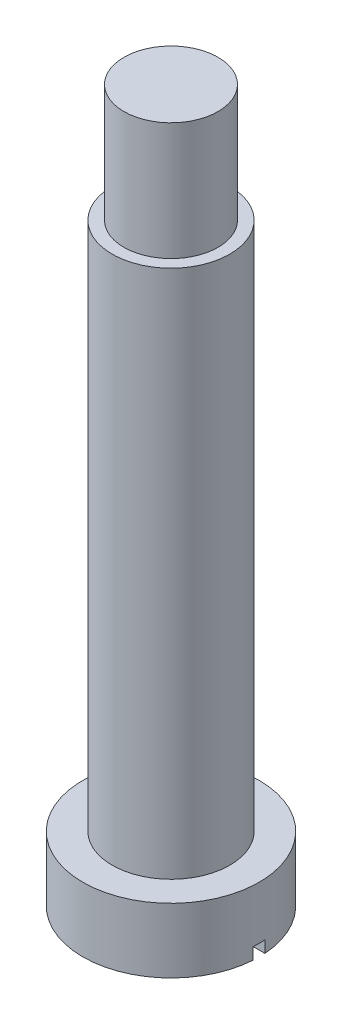
ISO-10303-21;
HEADER;
FILE_DESCRIPTION(('STEP AP214'),'2;1');
FILE_NAME('part.step','',(''),(''),'','','');
FILE_SCHEMA(('AUTOMOTIVE_DESIGN { 1 0 10303 214 1 1 1 1 }'));
ENDSEC;
DATA;
#1=APPLICATION_CONTEXT('core data for automotive mechanical design processes');
#2=APPLICATION_PROTOCOL_DEFINITION('international standard','automotive_design',2000,#1);
#3=PRODUCT_CONTEXT('',#1,'mechanical');
#4=PRODUCT('Part','Part','',(#3));
#5=PRODUCT_RELATED_PRODUCT_CATEGORY('part','',(#4));
#6=PRODUCT_DEFINITION_FORMATION('','',#4);
#7=PRODUCT_DEFINITION_CONTEXT('part definition',#1,'design');
#8=PRODUCT_DEFINITION('design','',#6,#7);
#9=PRODUCT_DEFINITION_SHAPE('','',#8);
#10=(LENGTH_UNIT() NAMED_UNIT(*) SI_UNIT(.MILLI.,.METRE.));
#11=(NAMED_UNIT(*) PLANE_ANGLE_UNIT() SI_UNIT($,.RADIAN.));
#12=(NAMED_UNIT(*) SI_UNIT($,.STERADIAN.) SOLID_ANGLE_UNIT());
#13=UNCERTAINTY_MEASURE_WITH_UNIT(LENGTH_MEASURE(1.E-05),#10,'distance_accuracy_value','');
#14=(GEOMETRIC_REPRESENTATION_CONTEXT(3) GLOBAL_UNCERTAINTY_ASSIGNED_CONTEXT((#13)) GLOBAL_UNIT_ASSIGNED_CONTEXT((#10,
#11,#12)) REPRESENTATION_CONTEXT('',''));
#15=CARTESIAN_POINT('',(0.,0.,0.));
#16=DIRECTION('',(0.,0.,1.));
#17=DIRECTION('',(1.,0.,0.));
#18=AXIS2_PLACEMENT_3D('',#15,#16,#17);
#19=CARTESIAN_POINT('',(0.,-5.5,0.));
#20=DIRECTION('',(0.,1.,0.));
#21=DIRECTION('',(0.,0.,1.));
#22=AXIS2_PLACEMENT_3D('',#19,#20,#21);
#23=CYLINDRICAL_SURFACE('',#22,7.5);
#24=CARTESIAN_POINT('',(0.,0.,0.));
#25=DIRECTION('',(0.,1.,0.));
#26=DIRECTION('',(0.,0.,1.));
#27=AXIS2_PLACEMENT_3D('',#24,#25,#26);
#28=CIRCLE('',#27,7.5);
#29=CARTESIAN_POINT('',(0.,0.,7.5));
#30=VERTEX_POINT('',#29);
#31=EDGE_CURVE('E112',#30,#30,#28,.T.);
#32=ORIENTED_EDGE('',*,*,#31,.F.);
#33=EDGE_LOOP('',(#32));
#34=FACE_BOUND('',#33,.T.);
#35=CARTESIAN_POINT('',(0.,-5.5,0.));
#36=DIRECTION('',(0.,1.,0.));
#37=DIRECTION('',(0.,0.,1.));
#38=AXIS2_PLACEMENT_3D('',#35,#36,#37);
#39=CIRCLE('',#38,7.5);
#40=CARTESIAN_POINT('',(7.48331477354788,-5.5,-0.5));
#41=VERTEX_POINT('',#40);
#42=CARTESIAN_POINT('',(-7.48331477354788,-5.5,-0.5));
#43=VERTEX_POINT('',#42);
#44=EDGE_CURVE('E115',#41,#43,#39,.T.);
#45=ORIENTED_EDGE('',*,*,#44,.T.);
#46=DIRECTION('',(0.,1.,0.));
#47=VECTOR('',#46,1.);
#48=CARTESIAN_POINT('',(-7.48331477354788,-5.5,-0.5));
#49=LINE('',#48,#47);
#50=CARTESIAN_POINT('',(-7.48331477354788,-4.5,-0.5));
#51=VERTEX_POINT('',#50);
#52=EDGE_CURVE('E84',#43,#51,#49,.T.);
#53=ORIENTED_EDGE('',*,*,#52,.T.);
#54=CARTESIAN_POINT('',(0.,-4.5,0.));
#55=DIRECTION('',(0.,1.,0.));
#56=DIRECTION('',(0.,0.,1.));
#57=AXIS2_PLACEMENT_3D('',#54,#55,#56);
#58=CIRCLE('',#57,7.5);
#59=CARTESIAN_POINT('',(-7.48331477354788,-4.5,0.5));
#60=VERTEX_POINT('',#59);
#61=EDGE_CURVE('E11',#60,#51,#58,.F.);
#62=ORIENTED_EDGE('',*,*,#61,.F.);
#63=DIRECTION('',(0.,1.,0.));
#64=VECTOR('',#63,1.);
#65=CARTESIAN_POINT('',(-7.48331477354788,-5.5,0.5));
#66=LINE('',#65,#64);
#67=CARTESIAN_POINT('',(-7.48331477354788,-5.5,0.5));
#68=VERTEX_POINT('',#67);
#69=EDGE_CURVE('E82',#68,#60,#66,.T.);
#70=ORIENTED_EDGE('',*,*,#69,.F.);
#71=CARTESIAN_POINT('',(7.48331477354788,-5.5,0.5));
#72=VERTEX_POINT('',#71);
#73=EDGE_CURVE('E116',#68,#72,#39,.T.);
#74=ORIENTED_EDGE('',*,*,#73,.T.);
#75=DIRECTION('',(0.,1.,0.));
#76=VECTOR('',#75,1.);
#77=CARTESIAN_POINT('',(7.48331477354788,-5.5,0.5));
#78=LINE('',#77,#76);
#79=CARTESIAN_POINT('',(7.48331477354788,-4.5,0.5));
#80=VERTEX_POINT('',#79);
#81=EDGE_CURVE('E52',#80,#72,#78,.F.);
#82=ORIENTED_EDGE('',*,*,#81,.F.);
#83=CARTESIAN_POINT('',(7.48331477354788,-4.5,-0.5));
#84=VERTEX_POINT('',#83);
#85=EDGE_CURVE('E41',#84,#80,#58,.F.);
#86=ORIENTED_EDGE('',*,*,#85,.F.);
#87=DIRECTION('',(0.,1.,0.));
#88=VECTOR('',#87,1.);
#89=CARTESIAN_POINT('',(7.48331477354788,-5.5,-0.5));
#90=LINE('',#89,#88);
#91=EDGE_CURVE('E100',#84,#41,#90,.F.);
#92=ORIENTED_EDGE('',*,*,#91,.T.);
#93=EDGE_LOOP('',(#45,#53,#62,#70,#74,#82,#86,#92));
#94=FACE_BOUND('',#93,.T.);
#95=ADVANCED_FACE('F38',(#34,#94),#23,.T.);
#96=CARTESIAN_POINT('',(0.,-5.5,0.));
#97=DIRECTION('',(0.,1.,0.));
#98=DIRECTION('',(0.,0.,1.));
#99=AXIS2_PLACEMENT_3D('',#96,#97,#98);
#100=PLANE('',#99);
#101=DIRECTION('',(1.,0.,0.));
#102=VECTOR('',#101,1.);
#103=CARTESIAN_POINT('',(0.,-5.5,-0.5));
#104=LINE('',#103,#102);
#105=EDGE_CURVE('E60',#43,#41,#104,.T.);
#106=ORIENTED_EDGE('',*,*,#105,.F.);
#107=ORIENTED_EDGE('',*,*,#44,.F.);
#108=EDGE_LOOP('',(#106,#107));
#109=FACE_BOUND('',#108,.T.);
#110=ADVANCED_FACE('F125',(#109),#100,.F.);
#111=ORIENTED_EDGE('',*,*,#73,.F.);
#112=DIRECTION('',(1.,0.,0.));
#113=VECTOR('',#112,1.);
#114=CARTESIAN_POINT('',(0.,-5.5,0.5));
#115=LINE('',#114,#113);
#116=EDGE_CURVE('E91',#68,#72,#115,.T.);
#117=ORIENTED_EDGE('',*,*,#116,.T.);
#118=EDGE_LOOP('',(#111,#117));
#119=FACE_BOUND('',#118,.T.);
#120=ADVANCED_FACE('F121',(#119),#100,.F.);
#121=CARTESIAN_POINT('',(0.,0.,0.));
#122=DIRECTION('',(0.,1.,0.));
#123=DIRECTION('',(0.,0.,1.));
#124=AXIS2_PLACEMENT_3D('',#121,#122,#123);
#125=PLANE('',#124);
#126=CARTESIAN_POINT('',(0.,0.,0.));
#127=DIRECTION('',(0.,1.,0.));
#128=DIRECTION('',(0.,0.,1.));
#129=AXIS2_PLACEMENT_3D('',#126,#127,#128);
#130=CIRCLE('',#129,5.);
#131=CARTESIAN_POINT('',(0.,0.,-5.));
#132=VERTEX_POINT('',#131);
#133=EDGE_CURVE('E109',#132,#132,#130,.T.);
#134=ORIENTED_EDGE('',*,*,#133,.F.);
#135=EDGE_LOOP('',(#134));
#136=FACE_BOUND('',#135,.T.);
#137=ORIENTED_EDGE('',*,*,#31,.T.);
#138=EDGE_LOOP('',(#137));
#139=FACE_BOUND('',#138,.T.);
#140=ADVANCED_FACE('F132',(#136,#139),#125,.T.);
#141=CARTESIAN_POINT('',(0.,45.,0.));
#142=DIRECTION('',(0.,-1.,0.));
#143=DIRECTION('',(0.,0.,-1.));
#144=AXIS2_PLACEMENT_3D('',#141,#142,#143);
#145=CYLINDRICAL_SURFACE('',#144,5.);
#146=CARTESIAN_POINT('',(0.,45.,0.));
#147=DIRECTION('',(0.,1.,0.));
#148=DIRECTION('',(0.,0.,1.));
#149=AXIS2_PLACEMENT_3D('',#146,#147,#148);
#150=CIRCLE('',#149,5.);
#151=CARTESIAN_POINT('',(0.,45.,-5.));
#152=VERTEX_POINT('',#151);
#153=EDGE_CURVE('E105',#152,#152,#150,.T.);
#154=CARTESIAN_POINT('',(0.,45.,-5.));
#155=CARTESIAN_POINT('',(0.,44.53125,-5.));
#156=CARTESIAN_POINT('',(0.,44.0625,-5.));
#157=CARTESIAN_POINT('',(0.,43.125,-5.));
#158=CARTESIAN_POINT('',(0.,42.65625,-5.));
#159=CARTESIAN_POINT('',(0.,41.71875,-5.));
#160=CARTESIAN_POINT('',(0.,41.25,-5.));
#161=CARTESIAN_POINT('',(0.,40.3125,-5.));
#162=CARTESIAN_POINT('',(0.,39.84375,-5.));
#163=CARTESIAN_POINT('',(0.,38.90625,-5.));
#164=CARTESIAN_POINT('',(0.,38.4375,-5.));
#165=CARTESIAN_POINT('',(0.,37.5,-5.));
#166=CARTESIAN_POINT('',(0.,37.03125,-5.));
#167=CARTESIAN_POINT('',(0.,36.09375,-5.));
#168=CARTESIAN_POINT('',(0.,35.625,-5.));
#169=CARTESIAN_POINT('',(0.,34.6875,-5.));
#170=CARTESIAN_POINT('',(0.,34.21875,-5.));
#171=CARTESIAN_POINT('',(0.,33.28125,-5.));
#172=CARTESIAN_POINT('',(0.,32.8125,-5.));
#173=CARTESIAN_POINT('',(0.,31.875,-5.));
#174=CARTESIAN_POINT('',(0.,31.40625,-5.));
#175=CARTESIAN_POINT('',(0.,30.46875,-5.));
#176=CARTESIAN_POINT('',(0.,30.,-5.));
#177=CARTESIAN_POINT('',(0.,29.0625,-5.));
#178=CARTESIAN_POINT('',(0.,28.59375,-5.));
#179=CARTESIAN_POINT('',(0.,27.65625,-5.));
#180=CARTESIAN_POINT('',(0.,27.1875,-5.));
#181=CARTESIAN_POINT('',(0.,26.25,-5.));
#182=CARTESIAN_POINT('',(0.,25.78125,-5.));
#183=CARTESIAN_POINT('',(0.,24.84375,-5.));
#184=CARTESIAN_POINT('',(0.,24.375,-5.));
#185=CARTESIAN_POINT('',(0.,23.4375,-5.));
#186=CARTESIAN_POINT('',(0.,22.96875,-5.));
#187=CARTESIAN_POINT('',(0.,22.03125,-5.));
#188=CARTESIAN_POINT('',(0.,21.5625,-5.));
#189=CARTESIAN_POINT('',(0.,20.625,-5.));
#190=CARTESIAN_POINT('',(0.,20.15625,-5.));
#191=CARTESIAN_POINT('',(0.,19.21875,-5.));
#192=CARTESIAN_POINT('',(0.,18.75,-5.));
#193=CARTESIAN_POINT('',(0.,17.8125,-5.));
#194=CARTESIAN_POINT('',(0.,17.34375,-5.));
#195=CARTESIAN_POINT('',(0.,16.40625,-5.));
#196=CARTESIAN_POINT('',(0.,15.9375,-5.));
#197=CARTESIAN_POINT('',(0.,15.,-5.));
#198=CARTESIAN_POINT('',(0.,14.53125,-5.));
#199=CARTESIAN_POINT('',(0.,13.59375,-5.));
#200=CARTESIAN_POINT('',(0.,13.125,-5.));
#201=CARTESIAN_POINT('',(0.,12.1875,-5.));
#202=CARTESIAN_POINT('',(0.,11.71875,-5.));
#203=CARTESIAN_POINT('',(0.,10.78125,-5.));
#204=CARTESIAN_POINT('',(0.,10.3125,-5.));
#205=CARTESIAN_POINT('',(0.,9.375,-5.));
#206=CARTESIAN_POINT('',(0.,8.90625,-5.));
#207=CARTESIAN_POINT('',(0.,7.96874999999999,-5.));
#208=CARTESIAN_POINT('',(0.,7.5,-5.));
#209=CARTESIAN_POINT('',(0.,6.5625,-5.));
#210=CARTESIAN_POINT('',(0.,6.09375,-5.));
#211=CARTESIAN_POINT('',(0.,5.15625,-5.));
#212=CARTESIAN_POINT('',(0.,4.68749999999999,-5.));
#213=CARTESIAN_POINT('',(0.,3.74999999999999,-5.));
#214=CARTESIAN_POINT('',(0.,3.28124999999999,-5.));
#215=CARTESIAN_POINT('',(0.,2.34374999999999,-5.));
#216=CARTESIAN_POINT('',(0.,1.87499999999999,-5.));
#217=CARTESIAN_POINT('',(0.,0.937499999999992,-5.));
#218=CARTESIAN_POINT('',(0.,0.468749999999993,-5.));
#219=CARTESIAN_POINT('',(0.,0.,-5.));
#220=B_SPLINE_CURVE_WITH_KNOTS('',3,(#154,#155,#156,#157,#158,#159,#160,#161,#162,#163,#164,
#165,#166,#167,#168,#169,#170,#171,#172,#173,#174,#175,#176,#177,#178,#179,#180,#181,#182,#183,
#184,#185,#186,#187,#188,#189,#190,#191,#192,#193,#194,#195,#196,#197,#198,#199,#200,#201,#202,
#203,#204,#205,#206,#207,#208,#209,#210,#211,#212,#213,#214,#215,#216,#217,#218,#219),
.UNSPECIFIED.,.F.,.F.,(4,2,2,2,2,2,2,2,2,2,2,2,2,2,2,2,2,2,2,2,2,2,2,2,2,2,2,2,2,2,2,2,4),(0.,
1.40625,2.8125,4.21875000000001,5.62500000000001,7.03125,8.4375,9.84375000000001,11.25,12.65625,
14.0625,15.46875,16.875,18.28125,19.6875,21.09375,22.5,23.90625,25.3125,26.71875,28.125,
29.53125,30.9375,32.34375,33.75,35.15625,36.5625,37.96875,39.375,40.78125,42.1875,43.59375,45.),.UNSPECIFIED.);
#221=EDGE_CURVE('BSEAM135',#152,#132,#220,.T.);
#222=ORIENTED_EDGE('',*,*,#153,.F.);
#223=ORIENTED_EDGE('',*,*,#133,.T.);
#224=ORIENTED_EDGE('',*,*,#221,.T.);
#225=ORIENTED_EDGE('',*,*,#221,.F.);
#226=EDGE_LOOP('',(#222,#224,#223,#225));
#227=FACE_BOUND('',#226,.T.);
#228=ADVANCED_FACE('F135',(#227),#145,.T.);
#229=CARTESIAN_POINT('',(0.,45.,0.));
#230=DIRECTION('',(0.,1.,0.));
#231=DIRECTION('',(0.,0.,1.));
#232=AXIS2_PLACEMENT_3D('',#229,#230,#231);
#233=PLANE('',#232);
#234=CARTESIAN_POINT('',(0.,45.,0.));
#235=DIRECTION('',(0.,1.,0.));
#236=DIRECTION('',(0.,0.,1.));
#237=AXIS2_PLACEMENT_3D('',#234,#235,#236);
#238=CIRCLE('',#237,4.);
#239=CARTESIAN_POINT('',(0.,45.,4.));
#240=VERTEX_POINT('',#239);
#241=EDGE_CURVE('E106',#240,#240,#238,.T.);
#242=ORIENTED_EDGE('',*,*,#241,.F.);
#243=EDGE_LOOP('',(#242));
#244=FACE_BOUND('',#243,.T.);
#245=ORIENTED_EDGE('',*,*,#153,.T.);
#246=EDGE_LOOP('',(#245));
#247=FACE_BOUND('',#246,.T.);
#248=ADVANCED_FACE('F142',(#244,#247),#233,.T.);
#249=CARTESIAN_POINT('',(0.,55.,0.));
#250=DIRECTION('',(0.,-1.,0.));
#251=DIRECTION('',(0.,0.,-1.));
#252=AXIS2_PLACEMENT_3D('',#249,#250,#251);
#253=CYLINDRICAL_SURFACE('',#252,4.);
#254=CARTESIAN_POINT('',(0.,55.,0.));
#255=DIRECTION('',(0.,1.,0.));
#256=DIRECTION('',(0.,0.,1.));
#257=AXIS2_PLACEMENT_3D('',#254,#255,#256);
#258=CIRCLE('',#257,4.);
#259=CARTESIAN_POINT('',(0.,55.,4.));
#260=VERTEX_POINT('',#259);
#261=EDGE_CURVE('E102',#260,#260,#258,.T.);
#262=ORIENTED_EDGE('',*,*,#261,.F.);
#263=EDGE_LOOP('',(#262));
#264=FACE_BOUND('',#263,.T.);
#265=ORIENTED_EDGE('',*,*,#241,.T.);
#266=EDGE_LOOP('',(#265));
#267=FACE_BOUND('',#266,.T.);
#268=ADVANCED_FACE('F151',(#264,#267),#253,.T.);
#269=CARTESIAN_POINT('',(0.,55.,0.));
#270=DIRECTION('',(0.,1.,0.));
#271=DIRECTION('',(0.,0.,1.));
#272=AXIS2_PLACEMENT_3D('',#269,#270,#271);
#273=PLANE('',#272);
#274=ORIENTED_EDGE('',*,*,#261,.T.);
#275=EDGE_LOOP('',(#274));
#276=FACE_BOUND('',#275,.T.);
#277=ADVANCED_FACE('F158',(#276),#273,.T.);
#278=CARTESIAN_POINT('',(-7.5,-5.500012,-0.5));
#279=DIRECTION('',(0.,0.,1.));
#280=DIRECTION('',(1.,0.,0.));
#281=AXIS2_PLACEMENT_3D('',#278,#279,#280);
#282=PLANE('',#281);
#283=DIRECTION('',(1.,0.,0.));
#284=VECTOR('',#283,1.);
#285=CARTESIAN_POINT('',(-7.5,-4.5,-0.5));
#286=LINE('',#285,#284);
#287=EDGE_CURVE('E94',#51,#84,#286,.T.);
#288=ORIENTED_EDGE('',*,*,#287,.F.);
#289=ORIENTED_EDGE('',*,*,#52,.F.);
#290=ORIENTED_EDGE('',*,*,#105,.T.);
#291=ORIENTED_EDGE('',*,*,#91,.F.);
#292=EDGE_LOOP('',(#288,#289,#290,#291));
#293=FACE_BOUND('',#292,.T.);
#294=ADVANCED_FACE('F123',(#293),#282,.T.);
#295=CARTESIAN_POINT('',(-7.5,-5.500012,0.5));
#296=DIRECTION('',(0.,0.,1.));
#297=DIRECTION('',(1.,0.,0.));
#298=AXIS2_PLACEMENT_3D('',#295,#296,#297);
#299=PLANE('',#298);
#300=ORIENTED_EDGE('',*,*,#81,.T.);
#301=ORIENTED_EDGE('',*,*,#116,.F.);
#302=ORIENTED_EDGE('',*,*,#69,.T.);
#303=DIRECTION('',(1.,0.,0.));
#304=VECTOR('',#303,1.);
#305=CARTESIAN_POINT('',(-7.5,-4.5,0.5));
#306=LINE('',#305,#304);
#307=EDGE_CURVE('E90',#60,#80,#306,.T.);
#308=ORIENTED_EDGE('',*,*,#307,.T.);
#309=EDGE_LOOP('',(#300,#301,#302,#308));
#310=FACE_BOUND('',#309,.T.);
#311=ADVANCED_FACE('F89',(#310),#299,.F.);
#312=CARTESIAN_POINT('',(0.,-4.5,0.));
#313=DIRECTION('',(0.,1.,0.));
#314=DIRECTION('',(-1.,0.,0.));
#315=AXIS2_PLACEMENT_3D('',#312,#313,#314);
#316=PLANE('',#315);
#317=ORIENTED_EDGE('',*,*,#307,.F.);
#318=ORIENTED_EDGE('',*,*,#61,.T.);
#319=ORIENTED_EDGE('',*,*,#287,.T.);
#320=ORIENTED_EDGE('',*,*,#85,.T.);
#321=EDGE_LOOP('',(#317,#318,#319,#320));
#322=FACE_BOUND('',#321,.T.);
#323=ADVANCED_FACE('F93',(#322),#316,.F.);
#324=CLOSED_SHELL('',(#95,#110,#120,#140,#228,#248,#268,#277,#294,#311,#323));
#325=MANIFOLD_SOLID_BREP('B2',#324);
#326=ADVANCED_BREP_SHAPE_REPRESENTATION('',(#18,#325),#14);
#327=SHAPE_DEFINITION_REPRESENTATION(#9,#326);
ENDSEC;
END-ISO-10303-21;
